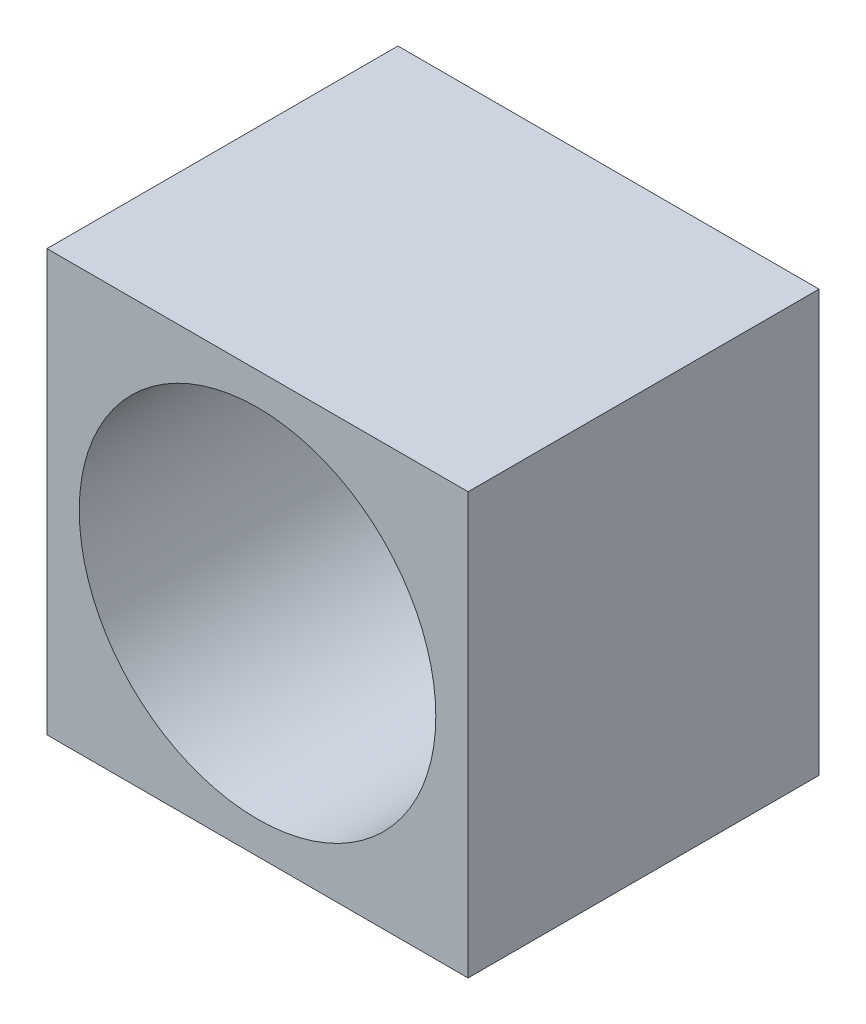
ISO-10303-21;
HEADER;
FILE_DESCRIPTION(('STEP AP214'),'2;1');
FILE_NAME('part.step','',(''),(''),'','','');
FILE_SCHEMA(('AUTOMOTIVE_DESIGN { 1 0 10303 214 1 1 1 1 }'));
ENDSEC;
DATA;
#1=APPLICATION_CONTEXT('core data for automotive mechanical design processes');
#2=APPLICATION_PROTOCOL_DEFINITION('international standard','automotive_design',2000,#1);
#3=PRODUCT_CONTEXT('',#1,'mechanical');
#4=PRODUCT('Part','Part','',(#3));
#5=PRODUCT_RELATED_PRODUCT_CATEGORY('part','',(#4));
#6=PRODUCT_DEFINITION_FORMATION('','',#4);
#7=PRODUCT_DEFINITION_CONTEXT('part definition',#1,'design');
#8=PRODUCT_DEFINITION('design','',#6,#7);
#9=PRODUCT_DEFINITION_SHAPE('','',#8);
#10=(LENGTH_UNIT() NAMED_UNIT(*) SI_UNIT(.MILLI.,.METRE.));
#11=(NAMED_UNIT(*) PLANE_ANGLE_UNIT() SI_UNIT($,.RADIAN.));
#12=(NAMED_UNIT(*) SI_UNIT($,.STERADIAN.) SOLID_ANGLE_UNIT());
#13=UNCERTAINTY_MEASURE_WITH_UNIT(LENGTH_MEASURE(1.E-05),#10,'distance_accuracy_value','');
#14=(GEOMETRIC_REPRESENTATION_CONTEXT(3) GLOBAL_UNCERTAINTY_ASSIGNED_CONTEXT((#13)) GLOBAL_UNIT_ASSIGNED_CONTEXT((#10,
#11,#12)) REPRESENTATION_CONTEXT('',''));
#15=CARTESIAN_POINT('',(0.,0.,0.));
#16=DIRECTION('',(0.,0.,1.));
#17=DIRECTION('',(1.,0.,0.));
#18=AXIS2_PLACEMENT_3D('',#15,#16,#17);
#19=CARTESIAN_POINT('',(15.,-15.,12.5));
#20=DIRECTION('',(1.,0.,0.));
#21=DIRECTION('',(0.,0.,-1.));
#22=AXIS2_PLACEMENT_3D('',#19,#20,#21);
#23=PLANE('',#22);
#24=DIRECTION('',(0.,1.,0.));
#25=VECTOR('',#24,1.);
#26=CARTESIAN_POINT('',(15.,-15.,-12.5));
#27=LINE('',#26,#25);
#28=CARTESIAN_POINT('',(15.,-15.,-12.5));
#29=VERTEX_POINT('',#28);
#30=CARTESIAN_POINT('',(15.,15.,-12.5));
#31=VERTEX_POINT('',#30);
#32=EDGE_CURVE('E46',#29,#31,#27,.T.);
#33=ORIENTED_EDGE('',*,*,#32,.T.);
#34=DIRECTION('',(0.,0.,-1.));
#35=VECTOR('',#34,1.);
#36=CARTESIAN_POINT('',(15.,15.,12.5));
#37=LINE('',#36,#35);
#38=CARTESIAN_POINT('',(15.,15.,12.5));
#39=VERTEX_POINT('',#38);
#40=EDGE_CURVE('E84',#39,#31,#37,.T.);
#41=ORIENTED_EDGE('',*,*,#40,.F.);
#42=DIRECTION('',(0.,1.,0.));
#43=VECTOR('',#42,1.);
#44=CARTESIAN_POINT('',(15.,-15.,12.5));
#45=LINE('',#44,#43);
#46=CARTESIAN_POINT('',(15.,-15.,12.5));
#47=VERTEX_POINT('',#46);
#48=EDGE_CURVE('E11',#47,#39,#45,.T.);
#49=ORIENTED_EDGE('',*,*,#48,.F.);
#50=DIRECTION('',(0.,0.,-1.));
#51=VECTOR('',#50,1.);
#52=CARTESIAN_POINT('',(15.,-15.,12.5));
#53=LINE('',#52,#51);
#54=EDGE_CURVE('E85',#47,#29,#53,.T.);
#55=ORIENTED_EDGE('',*,*,#54,.T.);
#56=EDGE_LOOP('',(#33,#41,#49,#55));
#57=FACE_BOUND('',#56,.T.);
#58=ADVANCED_FACE('F43',(#57),#23,.T.);
#59=CARTESIAN_POINT('',(-15.,-15.,12.5));
#60=DIRECTION('',(0.,0.,1.));
#61=DIRECTION('',(1.,0.,0.));
#62=AXIS2_PLACEMENT_3D('',#59,#60,#61);
#63=PLANE('',#62);
#64=CARTESIAN_POINT('',(0.,0.,12.5));
#65=DIRECTION('',(0.,0.,1.));
#66=DIRECTION('',(1.,0.,0.));
#67=AXIS2_PLACEMENT_3D('',#64,#65,#66);
#68=CIRCLE('',#67,12.7);
#69=CARTESIAN_POINT('',(12.7,0.,12.5));
#70=VERTEX_POINT('',#69);
#71=EDGE_CURVE('E109',#70,#70,#68,.T.);
#72=ORIENTED_EDGE('',*,*,#71,.F.);
#73=EDGE_LOOP('',(#72));
#74=FACE_BOUND('',#73,.T.);
#75=ORIENTED_EDGE('',*,*,#48,.T.);
#76=DIRECTION('',(1.,0.,0.));
#77=VECTOR('',#76,1.);
#78=CARTESIAN_POINT('',(-15.,15.,12.5));
#79=LINE('',#78,#77);
#80=CARTESIAN_POINT('',(-15.,15.,12.5));
#81=VERTEX_POINT('',#80);
#82=EDGE_CURVE('E103',#81,#39,#79,.T.);
#83=ORIENTED_EDGE('',*,*,#82,.F.);
#84=DIRECTION('',(0.,1.,0.));
#85=VECTOR('',#84,1.);
#86=CARTESIAN_POINT('',(-15.,-15.,12.5));
#87=LINE('',#86,#85);
#88=CARTESIAN_POINT('',(-15.,-15.,12.5));
#89=VERTEX_POINT('',#88);
#90=EDGE_CURVE('E52',#89,#81,#87,.T.);
#91=ORIENTED_EDGE('',*,*,#90,.F.);
#92=DIRECTION('',(1.,0.,0.));
#93=VECTOR('',#92,1.);
#94=CARTESIAN_POINT('',(-15.,-15.,12.5));
#95=LINE('',#94,#93);
#96=EDGE_CURVE('E91',#89,#47,#95,.T.);
#97=ORIENTED_EDGE('',*,*,#96,.T.);
#98=EDGE_LOOP('',(#75,#83,#91,#97));
#99=FACE_BOUND('',#98,.T.);
#100=ADVANCED_FACE('F133',(#74,#99),#63,.T.);
#101=CARTESIAN_POINT('',(-15.,-15.,12.5));
#102=DIRECTION('',(-1.,0.,0.));
#103=DIRECTION('',(0.,0.,1.));
#104=AXIS2_PLACEMENT_3D('',#101,#102,#103);
#105=PLANE('',#104);
#106=ORIENTED_EDGE('',*,*,#90,.T.);
#107=DIRECTION('',(0.,0.,1.));
#108=VECTOR('',#107,1.);
#109=CARTESIAN_POINT('',(-15.,15.,12.5));
#110=LINE('',#109,#108);
#111=CARTESIAN_POINT('',(-15.,15.,-12.5));
#112=VERTEX_POINT('',#111);
#113=EDGE_CURVE('E99',#112,#81,#110,.T.);
#114=ORIENTED_EDGE('',*,*,#113,.F.);
#115=DIRECTION('',(0.,1.,0.));
#116=VECTOR('',#115,1.);
#117=CARTESIAN_POINT('',(-15.,-15.,-12.5));
#118=LINE('',#117,#116);
#119=CARTESIAN_POINT('',(-15.,-15.,-12.5));
#120=VERTEX_POINT('',#119);
#121=EDGE_CURVE('E90',#120,#112,#118,.T.);
#122=ORIENTED_EDGE('',*,*,#121,.F.);
#123=DIRECTION('',(0.,0.,1.));
#124=VECTOR('',#123,1.);
#125=CARTESIAN_POINT('',(-15.,-15.,12.5));
#126=LINE('',#125,#124);
#127=EDGE_CURVE('E122',#120,#89,#126,.T.);
#128=ORIENTED_EDGE('',*,*,#127,.T.);
#129=EDGE_LOOP('',(#106,#114,#122,#128));
#130=FACE_BOUND('',#129,.T.);
#131=ADVANCED_FACE('F130',(#130),#105,.T.);
#132=CARTESIAN_POINT('',(-15.,-15.,-12.5));
#133=DIRECTION('',(0.,0.,-1.));
#134=DIRECTION('',(-1.,0.,0.));
#135=AXIS2_PLACEMENT_3D('',#132,#133,#134);
#136=PLANE('',#135);
#137=CARTESIAN_POINT('',(0.,0.,-12.5));
#138=DIRECTION('',(0.,0.,1.));
#139=DIRECTION('',(1.,0.,0.));
#140=AXIS2_PLACEMENT_3D('',#137,#138,#139);
#141=CIRCLE('',#140,12.7);
#142=CARTESIAN_POINT('',(12.7,0.,-12.5));
#143=VERTEX_POINT('',#142);
#144=EDGE_CURVE('E105',#143,#143,#141,.T.);
#145=ORIENTED_EDGE('',*,*,#144,.T.);
#146=EDGE_LOOP('',(#145));
#147=FACE_BOUND('',#146,.T.);
#148=ORIENTED_EDGE('',*,*,#121,.T.);
#149=DIRECTION('',(-1.,0.,0.));
#150=VECTOR('',#149,1.);
#151=CARTESIAN_POINT('',(-15.,15.,-12.5));
#152=LINE('',#151,#150);
#153=EDGE_CURVE('E93',#31,#112,#152,.T.);
#154=ORIENTED_EDGE('',*,*,#153,.F.);
#155=ORIENTED_EDGE('',*,*,#32,.F.);
#156=DIRECTION('',(-1.,0.,0.));
#157=VECTOR('',#156,1.);
#158=CARTESIAN_POINT('',(-15.,-15.,-12.5));
#159=LINE('',#158,#157);
#160=EDGE_CURVE('E119',#29,#120,#159,.T.);
#161=ORIENTED_EDGE('',*,*,#160,.T.);
#162=EDGE_LOOP('',(#148,#154,#155,#161));
#163=FACE_BOUND('',#162,.T.);
#164=ADVANCED_FACE('F94',(#147,#163),#136,.T.);
#165=CARTESIAN_POINT('',(0.,-15.,0.));
#166=DIRECTION('',(0.,-1.,0.));
#167=DIRECTION('',(0.,0.,-1.));
#168=AXIS2_PLACEMENT_3D('',#165,#166,#167);
#169=PLANE('',#168);
#170=ORIENTED_EDGE('',*,*,#54,.F.);
#171=ORIENTED_EDGE('',*,*,#96,.F.);
#172=ORIENTED_EDGE('',*,*,#127,.F.);
#173=ORIENTED_EDGE('',*,*,#160,.F.);
#174=EDGE_LOOP('',(#170,#171,#172,#173));
#175=FACE_BOUND('',#174,.T.);
#176=ADVANCED_FACE('F135',(#175),#169,.T.);
#177=CARTESIAN_POINT('',(0.,15.,0.));
#178=DIRECTION('',(0.,-1.,0.));
#179=DIRECTION('',(0.,0.,-1.));
#180=AXIS2_PLACEMENT_3D('',#177,#178,#179);
#181=PLANE('',#180);
#182=ORIENTED_EDGE('',*,*,#40,.T.);
#183=ORIENTED_EDGE('',*,*,#153,.T.);
#184=ORIENTED_EDGE('',*,*,#113,.T.);
#185=ORIENTED_EDGE('',*,*,#82,.T.);
#186=EDGE_LOOP('',(#182,#183,#184,#185));
#187=FACE_BOUND('',#186,.T.);
#188=ADVANCED_FACE('F102',(#187),#181,.F.);
#189=CARTESIAN_POINT('',(0.,0.,-12.5));
#190=DIRECTION('',(0.,0.,1.));
#191=DIRECTION('',(1.,0.,0.));
#192=AXIS2_PLACEMENT_3D('',#189,#190,#191);
#193=CYLINDRICAL_SURFACE('',#192,12.7);
#194=ORIENTED_EDGE('',*,*,#144,.F.);
#195=EDGE_LOOP('',(#194));
#196=FACE_BOUND('',#195,.T.);
#197=ORIENTED_EDGE('',*,*,#71,.T.);
#198=EDGE_LOOP('',(#197));
#199=FACE_BOUND('',#198,.T.);
#200=ADVANCED_FACE('F142',(#196,#199),#193,.F.);
#201=CLOSED_SHELL('',(#58,#100,#131,#164,#176,#188,#200));
#202=MANIFOLD_SOLID_BREP('B2',#201);
#203=ADVANCED_BREP_SHAPE_REPRESENTATION('',(#18,#202),#14);
#204=SHAPE_DEFINITION_REPRESENTATION(#9,#203);
ENDSEC;
END-ISO-10303-21;
